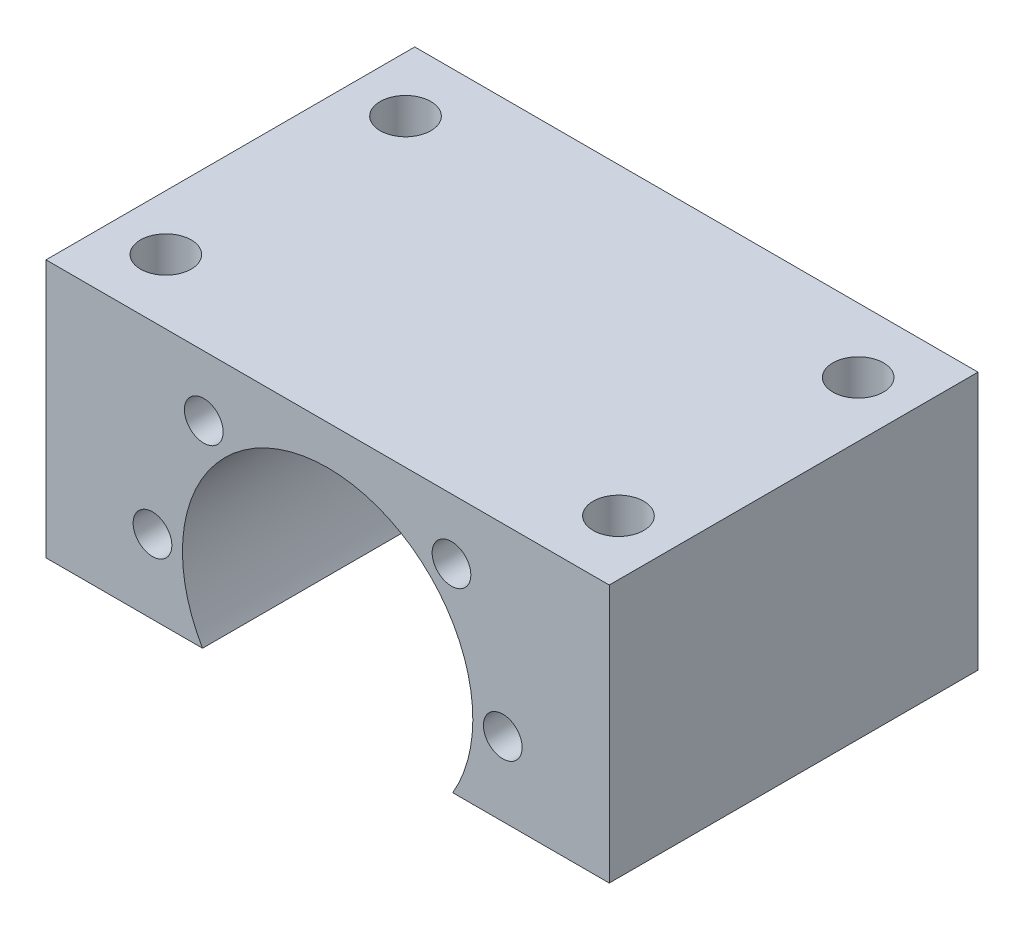
ISO-10303-21;
HEADER;
FILE_DESCRIPTION(('STEP AP214'),'2;1');
FILE_NAME('part.step','',(''),(''),'','','');
FILE_SCHEMA(('AUTOMOTIVE_DESIGN { 1 0 10303 214 1 1 1 1 }'));
ENDSEC;
DATA;
#1=APPLICATION_CONTEXT('core data for automotive mechanical design processes');
#2=APPLICATION_PROTOCOL_DEFINITION('international standard','automotive_design',2000,#1);
#3=PRODUCT_CONTEXT('',#1,'mechanical');
#4=PRODUCT('Part','Part','',(#3));
#5=PRODUCT_RELATED_PRODUCT_CATEGORY('part','',(#4));
#6=PRODUCT_DEFINITION_FORMATION('','',#4);
#7=PRODUCT_DEFINITION_CONTEXT('part definition',#1,'design');
#8=PRODUCT_DEFINITION('design','',#6,#7);
#9=PRODUCT_DEFINITION_SHAPE('','',#8);
#10=(LENGTH_UNIT() NAMED_UNIT(*) SI_UNIT(.MILLI.,.METRE.));
#11=(NAMED_UNIT(*) PLANE_ANGLE_UNIT() SI_UNIT($,.RADIAN.));
#12=(NAMED_UNIT(*) SI_UNIT($,.STERADIAN.) SOLID_ANGLE_UNIT());
#13=UNCERTAINTY_MEASURE_WITH_UNIT(LENGTH_MEASURE(1.E-05),#10,'distance_accuracy_value','');
#14=(GEOMETRIC_REPRESENTATION_CONTEXT(3) GLOBAL_UNCERTAINTY_ASSIGNED_CONTEXT((#13)) GLOBAL_UNIT_ASSIGNED_CONTEXT((#10,
#11,#12)) REPRESENTATION_CONTEXT('',''));
#15=CARTESIAN_POINT('',(0.,0.,0.));
#16=DIRECTION('',(0.,0.,1.));
#17=DIRECTION('',(1.,0.,0.));
#18=AXIS2_PLACEMENT_3D('',#15,#16,#17);
#19=CARTESIAN_POINT('',(27.55,12.,-107.210192679385));
#20=DIRECTION('',(0.,-1.,0.));
#21=DIRECTION('',(0.,0.,-1.));
#22=AXIS2_PLACEMENT_3D('',#19,#20,#21);
#23=PLANE('',#22);
#24=CARTESIAN_POINT('',(24.55,12.,-7.));
#25=DIRECTION('',(0.,-1.,0.));
#26=DIRECTION('',(0.,0.,-1.));
#27=AXIS2_PLACEMENT_3D('',#24,#25,#26);
#28=CIRCLE('',#27,2.75);
#29=CARTESIAN_POINT('',(24.55,12.,-9.75));
#30=VERTEX_POINT('',#29);
#31=EDGE_CURVE('E203',#30,#30,#28,.F.);
#32=ORIENTED_EDGE('',*,*,#31,.T.);
#33=EDGE_LOOP('',(#32));
#34=FACE_BOUND('',#33,.T.);
#35=DIRECTION('',(0.,0.,1.));
#36=VECTOR('',#35,1.);
#37=CARTESIAN_POINT('',(13.5669635512151,12.,-107.210192679385));
#38=LINE('',#37,#36);
#39=CARTESIAN_POINT('',(13.5669635512151,12.,-40.));
#40=VERTEX_POINT('',#39);
#41=CARTESIAN_POINT('',(13.5669635512151,12.,0.));
#42=VERTEX_POINT('',#41);
#43=EDGE_CURVE('E96',#40,#42,#38,.T.);
#44=ORIENTED_EDGE('',*,*,#43,.F.);
#45=DIRECTION('',(1.,0.,0.));
#46=VECTOR('',#45,1.);
#47=CARTESIAN_POINT('',(27.55,12.,-40.));
#48=LINE('',#47,#46);
#49=CARTESIAN_POINT('',(30.55,12.,-40.));
#50=VERTEX_POINT('',#49);
#51=EDGE_CURVE('E130',#40,#50,#48,.T.);
#52=ORIENTED_EDGE('',*,*,#51,.T.);
#53=DIRECTION('',(0.,0.,1.));
#54=VECTOR('',#53,1.);
#55=CARTESIAN_POINT('',(30.55,12.,-107.210192679385));
#56=LINE('',#55,#54);
#57=CARTESIAN_POINT('',(30.55,12.,0.));
#58=VERTEX_POINT('',#57);
#59=EDGE_CURVE('E37',#50,#58,#56,.T.);
#60=ORIENTED_EDGE('',*,*,#59,.T.);
#61=DIRECTION('',(1.,0.,0.));
#62=VECTOR('',#61,1.);
#63=CARTESIAN_POINT('',(27.55,12.,0.));
#64=LINE('',#63,#62);
#65=EDGE_CURVE('E138',#42,#58,#64,.T.);
#66=ORIENTED_EDGE('',*,*,#65,.F.);
#67=EDGE_LOOP('',(#44,#52,#60,#66));
#68=FACE_BOUND('',#67,.T.);
#69=CARTESIAN_POINT('',(24.55,12.,-33.));
#70=DIRECTION('',(0.,-1.,0.));
#71=DIRECTION('',(0.,0.,-1.));
#72=AXIS2_PLACEMENT_3D('',#69,#70,#71);
#73=CIRCLE('',#72,2.75);
#74=CARTESIAN_POINT('',(24.55,12.,-35.75));
#75=VERTEX_POINT('',#74);
#76=EDGE_CURVE('E131',#75,#75,#73,.T.);
#77=ORIENTED_EDGE('',*,*,#76,.F.);
#78=EDGE_LOOP('',(#77));
#79=FACE_BOUND('',#78,.T.);
#80=ADVANCED_FACE('F33',(#34,#68,#79),#23,.T.);
#81=CARTESIAN_POINT('',(-27.55,12.,-107.210192679385));
#82=DIRECTION('',(0.,-1.,0.));
#83=DIRECTION('',(0.,0.,-1.));
#84=AXIS2_PLACEMENT_3D('',#81,#82,#83);
#85=PLANE('',#84);
#86=CARTESIAN_POINT('',(-24.55,12.,-33.));
#87=DIRECTION('',(0.,-1.,0.));
#88=DIRECTION('',(0.,0.,-1.));
#89=AXIS2_PLACEMENT_3D('',#86,#87,#88);
#90=CIRCLE('',#89,2.75);
#91=CARTESIAN_POINT('',(-24.55,12.,-35.75));
#92=VERTEX_POINT('',#91);
#93=EDGE_CURVE('E197',#92,#92,#90,.F.);
#94=ORIENTED_EDGE('',*,*,#93,.T.);
#95=EDGE_LOOP('',(#94));
#96=FACE_BOUND('',#95,.T.);
#97=DIRECTION('',(0.,0.,1.));
#98=VECTOR('',#97,1.);
#99=CARTESIAN_POINT('',(-30.55,12.,-107.210192679385));
#100=LINE('',#99,#98);
#101=CARTESIAN_POINT('',(-30.55,12.,-40.));
#102=VERTEX_POINT('',#101);
#103=CARTESIAN_POINT('',(-30.55,12.,0.));
#104=VERTEX_POINT('',#103);
#105=EDGE_CURVE('E99',#102,#104,#100,.T.);
#106=ORIENTED_EDGE('',*,*,#105,.F.);
#107=DIRECTION('',(1.,0.,0.));
#108=VECTOR('',#107,1.);
#109=CARTESIAN_POINT('',(-27.55,12.,-40.));
#110=LINE('',#109,#108);
#111=CARTESIAN_POINT('',(-13.5669635512152,12.,-40.));
#112=VERTEX_POINT('',#111);
#113=EDGE_CURVE('E85',#102,#112,#110,.T.);
#114=ORIENTED_EDGE('',*,*,#113,.T.);
#115=DIRECTION('',(0.,0.,1.));
#116=VECTOR('',#115,1.);
#117=CARTESIAN_POINT('',(-13.5669635512152,12.,-107.210192679385));
#118=LINE('',#117,#116);
#119=CARTESIAN_POINT('',(-13.5669635512152,12.,0.));
#120=VERTEX_POINT('',#119);
#121=EDGE_CURVE('E95',#112,#120,#118,.T.);
#122=ORIENTED_EDGE('',*,*,#121,.T.);
#123=DIRECTION('',(1.,0.,0.));
#124=VECTOR('',#123,1.);
#125=CARTESIAN_POINT('',(-27.55,12.,0.));
#126=LINE('',#125,#124);
#127=EDGE_CURVE('E103',#104,#120,#126,.T.);
#128=ORIENTED_EDGE('',*,*,#127,.F.);
#129=EDGE_LOOP('',(#106,#114,#122,#128));
#130=FACE_BOUND('',#129,.T.);
#131=CARTESIAN_POINT('',(-24.55,12.,-7.));
#132=DIRECTION('',(0.,-1.,0.));
#133=DIRECTION('',(0.,0.,-1.));
#134=AXIS2_PLACEMENT_3D('',#131,#132,#133);
#135=CIRCLE('',#134,2.75);
#136=CARTESIAN_POINT('',(-24.55,12.,-9.75));
#137=VERTEX_POINT('',#136);
#138=EDGE_CURVE('E200',#137,#137,#135,.T.);
#139=ORIENTED_EDGE('',*,*,#138,.F.);
#140=EDGE_LOOP('',(#139));
#141=FACE_BOUND('',#140,.T.);
#142=ADVANCED_FACE('F100',(#96,#130,#141),#85,.T.);
#143=CARTESIAN_POINT('',(-30.55,40.,-107.210192679385));
#144=DIRECTION('',(0.,1.,0.));
#145=DIRECTION('',(0.,0.,1.));
#146=AXIS2_PLACEMENT_3D('',#143,#144,#145);
#147=PLANE('',#146);
#148=CARTESIAN_POINT('',(24.55,40.,-7.));
#149=DIRECTION('',(0.,1.,0.));
#150=DIRECTION('',(0.,0.,1.));
#151=AXIS2_PLACEMENT_3D('',#148,#149,#150);
#152=CIRCLE('',#151,2.75);
#153=CARTESIAN_POINT('',(24.55,40.,-4.25));
#154=VERTEX_POINT('',#153);
#155=EDGE_CURVE('E188',#154,#154,#152,.F.);
#156=ORIENTED_EDGE('',*,*,#155,.T.);
#157=EDGE_LOOP('',(#156));
#158=FACE_BOUND('',#157,.T.);
#159=CARTESIAN_POINT('',(-24.55,40.,-33.));
#160=DIRECTION('',(0.,1.,0.));
#161=DIRECTION('',(0.,0.,1.));
#162=AXIS2_PLACEMENT_3D('',#159,#160,#161);
#163=CIRCLE('',#162,2.75);
#164=CARTESIAN_POINT('',(-24.55,40.,-30.25));
#165=VERTEX_POINT('',#164);
#166=EDGE_CURVE('E194',#165,#165,#163,.F.);
#167=ORIENTED_EDGE('',*,*,#166,.T.);
#168=EDGE_LOOP('',(#167));
#169=FACE_BOUND('',#168,.T.);
#170=DIRECTION('',(0.,0.,1.));
#171=VECTOR('',#170,1.);
#172=CARTESIAN_POINT('',(30.55,40.,-107.210192679385));
#173=LINE('',#172,#171);
#174=CARTESIAN_POINT('',(30.55,40.,-40.));
#175=VERTEX_POINT('',#174);
#176=CARTESIAN_POINT('',(30.55,40.,0.));
#177=VERTEX_POINT('',#176);
#178=EDGE_CURVE('E116',#175,#177,#173,.T.);
#179=ORIENTED_EDGE('',*,*,#178,.F.);
#180=DIRECTION('',(-1.,0.,0.));
#181=VECTOR('',#180,1.);
#182=CARTESIAN_POINT('',(-30.55,40.,-40.));
#183=LINE('',#182,#181);
#184=CARTESIAN_POINT('',(-30.55,40.,-40.));
#185=VERTEX_POINT('',#184);
#186=EDGE_CURVE('E56',#175,#185,#183,.T.);
#187=ORIENTED_EDGE('',*,*,#186,.T.);
#188=DIRECTION('',(0.,0.,1.));
#189=VECTOR('',#188,1.);
#190=CARTESIAN_POINT('',(-30.55,40.,-107.210192679385));
#191=LINE('',#190,#189);
#192=CARTESIAN_POINT('',(-30.55,40.,0.));
#193=VERTEX_POINT('',#192);
#194=EDGE_CURVE('E109',#185,#193,#191,.T.);
#195=ORIENTED_EDGE('',*,*,#194,.T.);
#196=DIRECTION('',(-1.,0.,0.));
#197=VECTOR('',#196,1.);
#198=CARTESIAN_POINT('',(-30.55,40.,0.));
#199=LINE('',#198,#197);
#200=EDGE_CURVE('E150',#177,#193,#199,.T.);
#201=ORIENTED_EDGE('',*,*,#200,.F.);
#202=EDGE_LOOP('',(#179,#187,#195,#201));
#203=FACE_BOUND('',#202,.T.);
#204=CARTESIAN_POINT('',(-24.55,40.,-7.));
#205=DIRECTION('',(0.,1.,0.));
#206=DIRECTION('',(0.,0.,1.));
#207=AXIS2_PLACEMENT_3D('',#204,#205,#206);
#208=CIRCLE('',#207,2.75);
#209=CARTESIAN_POINT('',(-24.55,40.,-4.25));
#210=VERTEX_POINT('',#209);
#211=EDGE_CURVE('E183',#210,#210,#208,.T.);
#212=ORIENTED_EDGE('',*,*,#211,.F.);
#213=EDGE_LOOP('',(#212));
#214=FACE_BOUND('',#213,.T.);
#215=CARTESIAN_POINT('',(24.55,40.,-33.));
#216=DIRECTION('',(0.,1.,0.));
#217=DIRECTION('',(0.,0.,1.));
#218=AXIS2_PLACEMENT_3D('',#215,#216,#217);
#219=CIRCLE('',#218,2.75);
#220=CARTESIAN_POINT('',(24.55,40.,-30.25));
#221=VERTEX_POINT('',#220);
#222=EDGE_CURVE('E186',#221,#221,#219,.T.);
#223=ORIENTED_EDGE('',*,*,#222,.F.);
#224=EDGE_LOOP('',(#223));
#225=FACE_BOUND('',#224,.T.);
#226=ADVANCED_FACE('F174',(#158,#169,#203,#214,#225),#147,.T.);
#227=CARTESIAN_POINT('',(0.,20.,-107.210192679385));
#228=DIRECTION('',(0.,0.,1.));
#229=DIRECTION('',(1.,0.,0.));
#230=AXIS2_PLACEMENT_3D('',#227,#228,#229);
#231=CYLINDRICAL_SURFACE('',#230,15.75);
#232=ORIENTED_EDGE('',*,*,#121,.F.);
#233=CARTESIAN_POINT('',(0.,20.,-40.));
#234=DIRECTION('',(0.,0.,-1.));
#235=DIRECTION('',(-1.,0.,0.));
#236=AXIS2_PLACEMENT_3D('',#233,#234,#235);
#237=CIRCLE('',#236,15.75);
#238=EDGE_CURVE('E92',#112,#40,#237,.T.);
#239=ORIENTED_EDGE('',*,*,#238,.T.);
#240=ORIENTED_EDGE('',*,*,#43,.T.);
#241=CARTESIAN_POINT('',(0.,20.,0.));
#242=DIRECTION('',(0.,0.,-1.));
#243=DIRECTION('',(1.,0.,0.));
#244=AXIS2_PLACEMENT_3D('',#241,#242,#243);
#245=CIRCLE('',#244,15.75);
#246=EDGE_CURVE('E146',#120,#42,#245,.T.);
#247=ORIENTED_EDGE('',*,*,#246,.F.);
#248=EDGE_LOOP('',(#232,#239,#240,#247));
#249=FACE_BOUND('',#248,.T.);
#250=ADVANCED_FACE('F177',(#249),#231,.F.);
#251=CARTESIAN_POINT('',(-30.55,12.,-107.210192679385));
#252=DIRECTION('',(-1.,0.,0.));
#253=DIRECTION('',(0.,0.,1.));
#254=AXIS2_PLACEMENT_3D('',#251,#252,#253);
#255=PLANE('',#254);
#256=ORIENTED_EDGE('',*,*,#194,.F.);
#257=DIRECTION('',(0.,-1.,0.));
#258=VECTOR('',#257,1.);
#259=CARTESIAN_POINT('',(-30.55,12.,-40.));
#260=LINE('',#259,#258);
#261=EDGE_CURVE('E89',#185,#102,#260,.T.);
#262=ORIENTED_EDGE('',*,*,#261,.T.);
#263=ORIENTED_EDGE('',*,*,#105,.T.);
#264=DIRECTION('',(0.,-1.,0.));
#265=VECTOR('',#264,1.);
#266=CARTESIAN_POINT('',(-30.55,12.,0.));
#267=LINE('',#266,#265);
#268=EDGE_CURVE('E152',#193,#104,#267,.T.);
#269=ORIENTED_EDGE('',*,*,#268,.F.);
#270=EDGE_LOOP('',(#256,#262,#263,#269));
#271=FACE_BOUND('',#270,.T.);
#272=ADVANCED_FACE('F108',(#271),#255,.T.);
#273=CARTESIAN_POINT('',(30.55,40.,-107.210192679385));
#274=DIRECTION('',(1.,0.,0.));
#275=DIRECTION('',(0.,0.,-1.));
#276=AXIS2_PLACEMENT_3D('',#273,#274,#275);
#277=PLANE('',#276);
#278=ORIENTED_EDGE('',*,*,#59,.F.);
#279=DIRECTION('',(0.,1.,0.));
#280=VECTOR('',#279,1.);
#281=CARTESIAN_POINT('',(30.55,40.,-40.));
#282=LINE('',#281,#280);
#283=EDGE_CURVE('E50',#50,#175,#282,.T.);
#284=ORIENTED_EDGE('',*,*,#283,.T.);
#285=ORIENTED_EDGE('',*,*,#178,.T.);
#286=DIRECTION('',(0.,1.,0.));
#287=VECTOR('',#286,1.);
#288=CARTESIAN_POINT('',(30.55,40.,0.));
#289=LINE('',#288,#287);
#290=EDGE_CURVE('E144',#58,#177,#289,.T.);
#291=ORIENTED_EDGE('',*,*,#290,.F.);
#292=EDGE_LOOP('',(#278,#284,#285,#291));
#293=FACE_BOUND('',#292,.T.);
#294=ADVANCED_FACE('F149',(#293),#277,.T.);
#295=CARTESIAN_POINT('',(-13.4350288425445,33.4350288425443,-107.210192679385));
#296=DIRECTION('',(0.,0.,1.));
#297=DIRECTION('',(1.,0.,0.));
#298=AXIS2_PLACEMENT_3D('',#295,#296,#297);
#299=CYLINDRICAL_SURFACE('',#298,2.1);
#300=CARTESIAN_POINT('',(-13.4350288425445,33.4350288425443,0.));
#301=DIRECTION('',(0.,0.,1.));
#302=DIRECTION('',(1.,0.,0.));
#303=AXIS2_PLACEMENT_3D('',#300,#301,#302);
#304=CIRCLE('',#303,2.1);
#305=CARTESIAN_POINT('',(-11.3350288425445,33.4350288425443,0.));
#306=VERTEX_POINT('',#305);
#307=EDGE_CURVE('E117',#306,#306,#304,.T.);
#308=ORIENTED_EDGE('',*,*,#307,.T.);
#309=EDGE_LOOP('',(#308));
#310=FACE_BOUND('',#309,.T.);
#311=CARTESIAN_POINT('',(-13.4350288425445,33.4350288425443,-40.));
#312=DIRECTION('',(0.,0.,-1.));
#313=DIRECTION('',(-1.,0.,0.));
#314=AXIS2_PLACEMENT_3D('',#311,#312,#313);
#315=CIRCLE('',#314,2.1);
#316=CARTESIAN_POINT('',(-15.5350288425445,33.4350288425443,-40.));
#317=VERTEX_POINT('',#316);
#318=EDGE_CURVE('E11',#317,#317,#315,.F.);
#319=ORIENTED_EDGE('',*,*,#318,.F.);
#320=EDGE_LOOP('',(#319));
#321=FACE_BOUND('',#320,.T.);
#322=ADVANCED_FACE('F219',(#310,#321),#299,.F.);
#323=CARTESIAN_POINT('',(19.,20.,-107.210192679385));
#324=DIRECTION('',(0.,0.,1.));
#325=DIRECTION('',(1.,0.,0.));
#326=AXIS2_PLACEMENT_3D('',#323,#324,#325);
#327=CYLINDRICAL_SURFACE('',#326,2.1);
#328=CARTESIAN_POINT('',(19.,20.,0.));
#329=DIRECTION('',(0.,0.,1.));
#330=DIRECTION('',(1.,0.,0.));
#331=AXIS2_PLACEMENT_3D('',#328,#329,#330);
#332=CIRCLE('',#331,2.1);
#333=CARTESIAN_POINT('',(21.1,20.,0.));
#334=VERTEX_POINT('',#333);
#335=EDGE_CURVE('E122',#334,#334,#332,.T.);
#336=ORIENTED_EDGE('',*,*,#335,.T.);
#337=EDGE_LOOP('',(#336));
#338=FACE_BOUND('',#337,.T.);
#339=CARTESIAN_POINT('',(19.,20.,-40.));
#340=DIRECTION('',(0.,0.,-1.));
#341=DIRECTION('',(-1.,0.,0.));
#342=AXIS2_PLACEMENT_3D('',#339,#340,#341);
#343=CIRCLE('',#342,2.1);
#344=CARTESIAN_POINT('',(16.9,20.,-40.));
#345=VERTEX_POINT('',#344);
#346=EDGE_CURVE('E128',#345,#345,#343,.F.);
#347=ORIENTED_EDGE('',*,*,#346,.F.);
#348=EDGE_LOOP('',(#347));
#349=FACE_BOUND('',#348,.T.);
#350=ADVANCED_FACE('F222',(#338,#349),#327,.F.);
#351=CARTESIAN_POINT('',(13.4350288425444,33.4350288425443,-107.210192679385));
#352=DIRECTION('',(0.,0.,1.));
#353=DIRECTION('',(1.,0.,0.));
#354=AXIS2_PLACEMENT_3D('',#351,#352,#353);
#355=CYLINDRICAL_SURFACE('',#354,2.1);
#356=CARTESIAN_POINT('',(13.4350288425444,33.4350288425443,0.));
#357=DIRECTION('',(0.,0.,1.));
#358=DIRECTION('',(1.,0.,0.));
#359=AXIS2_PLACEMENT_3D('',#356,#357,#358);
#360=CIRCLE('',#359,2.1);
#361=CARTESIAN_POINT('',(15.5350288425444,33.4350288425443,0.));
#362=VERTEX_POINT('',#361);
#363=EDGE_CURVE('E158',#362,#362,#360,.T.);
#364=ORIENTED_EDGE('',*,*,#363,.T.);
#365=EDGE_LOOP('',(#364));
#366=FACE_BOUND('',#365,.T.);
#367=CARTESIAN_POINT('',(13.4350288425444,33.4350288425443,-40.));
#368=DIRECTION('',(0.,0.,-1.));
#369=DIRECTION('',(-1.,0.,0.));
#370=AXIS2_PLACEMENT_3D('',#367,#368,#369);
#371=CIRCLE('',#370,2.1);
#372=CARTESIAN_POINT('',(11.3350288425444,33.4350288425443,-40.));
#373=VERTEX_POINT('',#372);
#374=EDGE_CURVE('E42',#373,#373,#371,.F.);
#375=ORIENTED_EDGE('',*,*,#374,.F.);
#376=EDGE_LOOP('',(#375));
#377=FACE_BOUND('',#376,.T.);
#378=ADVANCED_FACE('F226',(#366,#377),#355,.F.);
#379=CARTESIAN_POINT('',(-19.,20.,-107.210192679385));
#380=DIRECTION('',(0.,0.,1.));
#381=DIRECTION('',(1.,0.,0.));
#382=AXIS2_PLACEMENT_3D('',#379,#380,#381);
#383=CYLINDRICAL_SURFACE('',#382,2.1);
#384=CARTESIAN_POINT('',(-19.,20.,0.));
#385=DIRECTION('',(0.,0.,1.));
#386=DIRECTION('',(1.,0.,0.));
#387=AXIS2_PLACEMENT_3D('',#384,#385,#386);
#388=CIRCLE('',#387,2.1);
#389=CARTESIAN_POINT('',(-16.9,20.,0.));
#390=VERTEX_POINT('',#389);
#391=EDGE_CURVE('E147',#390,#390,#388,.T.);
#392=ORIENTED_EDGE('',*,*,#391,.T.);
#393=EDGE_LOOP('',(#392));
#394=FACE_BOUND('',#393,.T.);
#395=CARTESIAN_POINT('',(-19.,20.,-40.));
#396=DIRECTION('',(0.,0.,-1.));
#397=DIRECTION('',(-1.,0.,0.));
#398=AXIS2_PLACEMENT_3D('',#395,#396,#397);
#399=CIRCLE('',#398,2.1);
#400=CARTESIAN_POINT('',(-21.1,20.,-40.));
#401=VERTEX_POINT('',#400);
#402=EDGE_CURVE('E164',#401,#401,#399,.F.);
#403=ORIENTED_EDGE('',*,*,#402,.F.);
#404=EDGE_LOOP('',(#403));
#405=FACE_BOUND('',#404,.T.);
#406=ADVANCED_FACE('F229',(#394,#405),#383,.F.);
#407=CARTESIAN_POINT('',(0.,20.,0.));
#408=DIRECTION('',(0.,0.,1.));
#409=DIRECTION('',(1.,0.,0.));
#410=AXIS2_PLACEMENT_3D('',#407,#408,#409);
#411=PLANE('',#410);
#412=ORIENTED_EDGE('',*,*,#391,.F.);
#413=EDGE_LOOP('',(#412));
#414=FACE_BOUND('',#413,.T.);
#415=ORIENTED_EDGE('',*,*,#363,.F.);
#416=EDGE_LOOP('',(#415));
#417=FACE_BOUND('',#416,.T.);
#418=ORIENTED_EDGE('',*,*,#335,.F.);
#419=EDGE_LOOP('',(#418));
#420=FACE_BOUND('',#419,.T.);
#421=ORIENTED_EDGE('',*,*,#307,.F.);
#422=EDGE_LOOP('',(#421));
#423=FACE_BOUND('',#422,.T.);
#424=ORIENTED_EDGE('',*,*,#65,.T.);
#425=ORIENTED_EDGE('',*,*,#290,.T.);
#426=ORIENTED_EDGE('',*,*,#200,.T.);
#427=ORIENTED_EDGE('',*,*,#268,.T.);
#428=ORIENTED_EDGE('',*,*,#127,.T.);
#429=ORIENTED_EDGE('',*,*,#246,.T.);
#430=EDGE_LOOP('',(#424,#425,#426,#427,#428,#429));
#431=FACE_BOUND('',#430,.T.);
#432=ADVANCED_FACE('F142',(#414,#417,#420,#423,#431),#411,.T.);
#433=CARTESIAN_POINT('',(0.,12.,-40.));
#434=DIRECTION('',(0.,0.,-1.));
#435=DIRECTION('',(0.,-1.,0.));
#436=AXIS2_PLACEMENT_3D('',#433,#434,#435);
#437=PLANE('',#436);
#438=ORIENTED_EDGE('',*,*,#51,.F.);
#439=ORIENTED_EDGE('',*,*,#238,.F.);
#440=ORIENTED_EDGE('',*,*,#113,.F.);
#441=ORIENTED_EDGE('',*,*,#261,.F.);
#442=ORIENTED_EDGE('',*,*,#186,.F.);
#443=ORIENTED_EDGE('',*,*,#283,.F.);
#444=EDGE_LOOP('',(#438,#439,#440,#441,#442,#443));
#445=FACE_BOUND('',#444,.T.);
#446=ORIENTED_EDGE('',*,*,#346,.T.);
#447=EDGE_LOOP('',(#446));
#448=FACE_BOUND('',#447,.T.);
#449=ORIENTED_EDGE('',*,*,#402,.T.);
#450=EDGE_LOOP('',(#449));
#451=FACE_BOUND('',#450,.T.);
#452=ORIENTED_EDGE('',*,*,#374,.T.);
#453=EDGE_LOOP('',(#452));
#454=FACE_BOUND('',#453,.T.);
#455=ORIENTED_EDGE('',*,*,#318,.T.);
#456=EDGE_LOOP('',(#455));
#457=FACE_BOUND('',#456,.T.);
#458=ADVANCED_FACE('F35',(#445,#448,#451,#454,#457),#437,.T.);
#459=CARTESIAN_POINT('',(-24.55,-10.,-33.));
#460=DIRECTION('',(0.,1.,0.));
#461=DIRECTION('',(0.,0.,1.));
#462=AXIS2_PLACEMENT_3D('',#459,#460,#461);
#463=CYLINDRICAL_SURFACE('',#462,2.75);
#464=ORIENTED_EDGE('',*,*,#93,.F.);
#465=EDGE_LOOP('',(#464));
#466=FACE_BOUND('',#465,.T.);
#467=ORIENTED_EDGE('',*,*,#166,.F.);
#468=EDGE_LOOP('',(#467));
#469=FACE_BOUND('',#468,.T.);
#470=ADVANCED_FACE('F250',(#466,#469),#463,.F.);
#471=CARTESIAN_POINT('',(-24.55,-10.,-7.));
#472=DIRECTION('',(0.,1.,0.));
#473=DIRECTION('',(0.,0.,1.));
#474=AXIS2_PLACEMENT_3D('',#471,#472,#473);
#475=CYLINDRICAL_SURFACE('',#474,2.75);
#476=ORIENTED_EDGE('',*,*,#138,.T.);
#477=EDGE_LOOP('',(#476));
#478=FACE_BOUND('',#477,.T.);
#479=ORIENTED_EDGE('',*,*,#211,.T.);
#480=EDGE_LOOP('',(#479));
#481=FACE_BOUND('',#480,.T.);
#482=ADVANCED_FACE('F254',(#478,#481),#475,.F.);
#483=CARTESIAN_POINT('',(24.55,-10.,-7.));
#484=DIRECTION('',(0.,1.,0.));
#485=DIRECTION('',(0.,0.,1.));
#486=AXIS2_PLACEMENT_3D('',#483,#484,#485);
#487=CYLINDRICAL_SURFACE('',#486,2.75);
#488=ORIENTED_EDGE('',*,*,#31,.F.);
#489=EDGE_LOOP('',(#488));
#490=FACE_BOUND('',#489,.T.);
#491=ORIENTED_EDGE('',*,*,#155,.F.);
#492=EDGE_LOOP('',(#491));
#493=FACE_BOUND('',#492,.T.);
#494=ADVANCED_FACE('F260',(#490,#493),#487,.F.);
#495=CARTESIAN_POINT('',(24.55,-10.,-33.));
#496=DIRECTION('',(0.,1.,0.));
#497=DIRECTION('',(0.,0.,1.));
#498=AXIS2_PLACEMENT_3D('',#495,#496,#497);
#499=CYLINDRICAL_SURFACE('',#498,2.75);
#500=ORIENTED_EDGE('',*,*,#76,.T.);
#501=EDGE_LOOP('',(#500));
#502=FACE_BOUND('',#501,.T.);
#503=ORIENTED_EDGE('',*,*,#222,.T.);
#504=EDGE_LOOP('',(#503));
#505=FACE_BOUND('',#504,.T.);
#506=ADVANCED_FACE('F208',(#502,#505),#499,.F.);
#507=CLOSED_SHELL('',(#80,#142,#226,#250,#272,#294,#322,#350,#378,#406,#432,#458,#470,#482,#494,#506));
#508=MANIFOLD_SOLID_BREP('B2',#507);
#509=ADVANCED_BREP_SHAPE_REPRESENTATION('',(#18,#508),#14);
#510=SHAPE_DEFINITION_REPRESENTATION(#9,#509);
ENDSEC;
END-ISO-10303-21;
